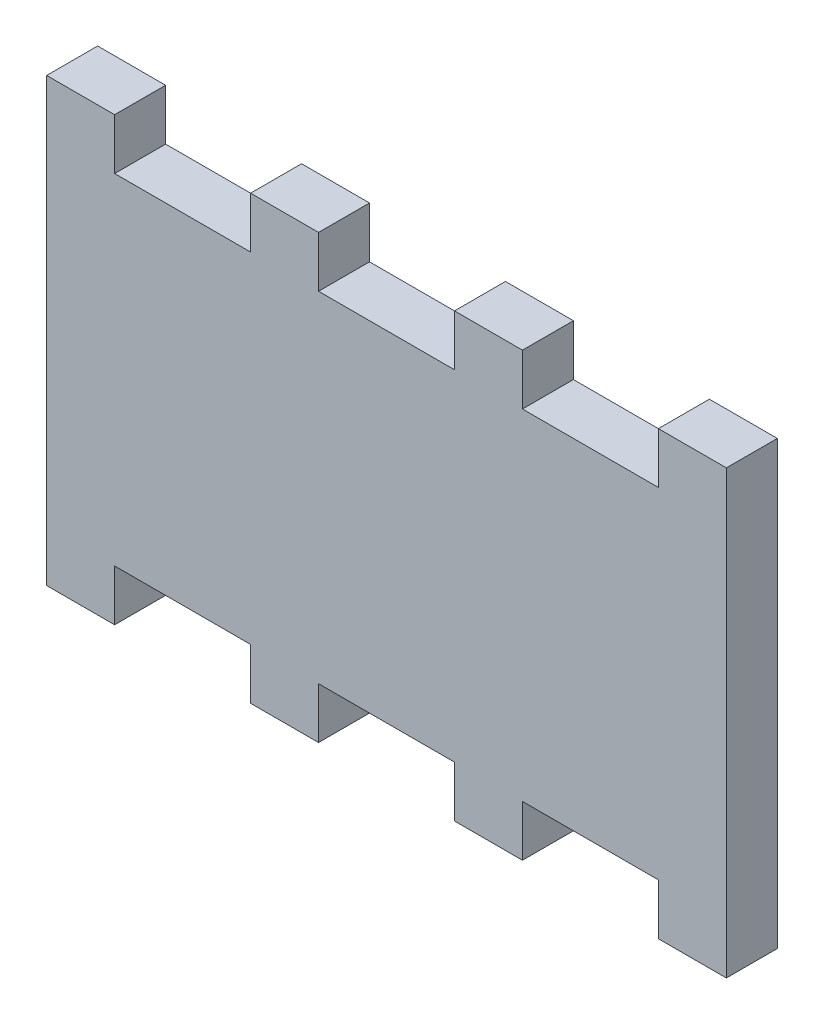
ISO-10303-21;
HEADER;
FILE_DESCRIPTION(('STEP AP214'),'2;1');
FILE_NAME('part.step','',(''),(''),'','','');
FILE_SCHEMA(('AUTOMOTIVE_DESIGN { 1 0 10303 214 1 1 1 1 }'));
ENDSEC;
DATA;
#1=APPLICATION_CONTEXT('core data for automotive mechanical design processes');
#2=APPLICATION_PROTOCOL_DEFINITION('international standard','automotive_design',2000,#1);
#3=PRODUCT_CONTEXT('',#1,'mechanical');
#4=PRODUCT('Part','Part','',(#3));
#5=PRODUCT_RELATED_PRODUCT_CATEGORY('part','',(#4));
#6=PRODUCT_DEFINITION_FORMATION('','',#4);
#7=PRODUCT_DEFINITION_CONTEXT('part definition',#1,'design');
#8=PRODUCT_DEFINITION('design','',#6,#7);
#9=PRODUCT_DEFINITION_SHAPE('','',#8);
#10=(LENGTH_UNIT() NAMED_UNIT(*) SI_UNIT(.MILLI.,.METRE.));
#11=(NAMED_UNIT(*) PLANE_ANGLE_UNIT() SI_UNIT($,.RADIAN.));
#12=(NAMED_UNIT(*) SI_UNIT($,.STERADIAN.) SOLID_ANGLE_UNIT());
#13=UNCERTAINTY_MEASURE_WITH_UNIT(LENGTH_MEASURE(1.E-05),#10,'distance_accuracy_value','');
#14=(GEOMETRIC_REPRESENTATION_CONTEXT(3) GLOBAL_UNCERTAINTY_ASSIGNED_CONTEXT((#13)) GLOBAL_UNIT_ASSIGNED_CONTEXT((#10,
#11,#12)) REPRESENTATION_CONTEXT('',''));
#15=CARTESIAN_POINT('',(0.,0.,0.));
#16=DIRECTION('',(0.,0.,1.));
#17=DIRECTION('',(1.,0.,0.));
#18=AXIS2_PLACEMENT_3D('',#15,#16,#17);
#19=CARTESIAN_POINT('',(0.,-6.,6.));
#20=DIRECTION('',(0.,1.,0.));
#21=DIRECTION('',(0.,0.,1.));
#22=AXIS2_PLACEMENT_3D('',#19,#20,#21);
#23=PLANE('',#22);
#24=DIRECTION('',(1.,0.,0.));
#25=VECTOR('',#24,1.);
#26=CARTESIAN_POINT('',(0.,-6.,0.));
#27=LINE('',#26,#25);
#28=CARTESIAN_POINT('',(0.,-6.,0.));
#29=VERTEX_POINT('',#28);
#30=CARTESIAN_POINT('',(8.,-6.,0.));
#31=VERTEX_POINT('',#30);
#32=EDGE_CURVE('E191',#29,#31,#27,.T.);
#33=ORIENTED_EDGE('',*,*,#32,.T.);
#34=DIRECTION('',(0.,0.,-1.));
#35=VECTOR('',#34,1.);
#36=CARTESIAN_POINT('',(8.,-6.,6.));
#37=LINE('',#36,#35);
#38=CARTESIAN_POINT('',(8.,-6.,6.));
#39=VERTEX_POINT('',#38);
#40=EDGE_CURVE('E136',#39,#31,#37,.T.);
#41=ORIENTED_EDGE('',*,*,#40,.F.);
#42=DIRECTION('',(1.,0.,0.));
#43=VECTOR('',#42,1.);
#44=CARTESIAN_POINT('',(0.,-6.,6.));
#45=LINE('',#44,#43);
#46=CARTESIAN_POINT('',(0.,-6.,6.));
#47=VERTEX_POINT('',#46);
#48=EDGE_CURVE('E274',#47,#39,#45,.T.);
#49=ORIENTED_EDGE('',*,*,#48,.F.);
#50=DIRECTION('',(0.,0.,-1.));
#51=VECTOR('',#50,1.);
#52=CARTESIAN_POINT('',(0.,-6.,6.));
#53=LINE('',#52,#51);
#54=EDGE_CURVE('E267',#47,#29,#53,.T.);
#55=ORIENTED_EDGE('',*,*,#54,.T.);
#56=EDGE_LOOP('',(#33,#41,#49,#55));
#57=FACE_BOUND('',#56,.T.);
#58=ADVANCED_FACE('F126',(#57),#23,.F.);
#59=CARTESIAN_POINT('',(8.,0.,6.));
#60=DIRECTION('',(-1.,0.,0.));
#61=DIRECTION('',(0.,0.,1.));
#62=AXIS2_PLACEMENT_3D('',#59,#60,#61);
#63=PLANE('',#62);
#64=DIRECTION('',(0.,1.,0.));
#65=VECTOR('',#64,1.);
#66=CARTESIAN_POINT('',(8.,0.,0.));
#67=LINE('',#66,#65);
#68=CARTESIAN_POINT('',(8.,0.,0.));
#69=VERTEX_POINT('',#68);
#70=EDGE_CURVE('E329',#31,#69,#67,.T.);
#71=ORIENTED_EDGE('',*,*,#70,.T.);
#72=DIRECTION('',(0.,0.,-1.));
#73=VECTOR('',#72,1.);
#74=CARTESIAN_POINT('',(8.,0.,6.));
#75=LINE('',#74,#73);
#76=CARTESIAN_POINT('',(8.,0.,6.));
#77=VERTEX_POINT('',#76);
#78=EDGE_CURVE('E198',#77,#69,#75,.T.);
#79=ORIENTED_EDGE('',*,*,#78,.F.);
#80=DIRECTION('',(0.,1.,0.));
#81=VECTOR('',#80,1.);
#82=CARTESIAN_POINT('',(8.,0.,6.));
#83=LINE('',#82,#81);
#84=EDGE_CURVE('E395',#39,#77,#83,.T.);
#85=ORIENTED_EDGE('',*,*,#84,.F.);
#86=ORIENTED_EDGE('',*,*,#40,.T.);
#87=EDGE_LOOP('',(#71,#79,#85,#86));
#88=FACE_BOUND('',#87,.T.);
#89=ADVANCED_FACE('F413',(#88),#63,.F.);
#90=CARTESIAN_POINT('',(0.,0.,6.));
#91=DIRECTION('',(0.,1.,0.));
#92=DIRECTION('',(0.,0.,1.));
#93=AXIS2_PLACEMENT_3D('',#90,#91,#92);
#94=PLANE('',#93);
#95=DIRECTION('',(1.,0.,0.));
#96=VECTOR('',#95,1.);
#97=CARTESIAN_POINT('',(0.,0.,0.));
#98=LINE('',#97,#96);
#99=CARTESIAN_POINT('',(24.,0.,0.));
#100=VERTEX_POINT('',#99);
#101=EDGE_CURVE('E326',#69,#100,#98,.T.);
#102=ORIENTED_EDGE('',*,*,#101,.T.);
#103=DIRECTION('',(0.,0.,-1.));
#104=VECTOR('',#103,1.);
#105=CARTESIAN_POINT('',(24.,0.,6.));
#106=LINE('',#105,#104);
#107=CARTESIAN_POINT('',(24.,0.,6.));
#108=VERTEX_POINT('',#107);
#109=EDGE_CURVE('E201',#108,#100,#106,.T.);
#110=ORIENTED_EDGE('',*,*,#109,.F.);
#111=DIRECTION('',(1.,0.,0.));
#112=VECTOR('',#111,1.);
#113=CARTESIAN_POINT('',(0.,0.,6.));
#114=LINE('',#113,#112);
#115=EDGE_CURVE('E392',#77,#108,#114,.T.);
#116=ORIENTED_EDGE('',*,*,#115,.F.);
#117=ORIENTED_EDGE('',*,*,#78,.T.);
#118=EDGE_LOOP('',(#102,#110,#116,#117));
#119=FACE_BOUND('',#118,.T.);
#120=ADVANCED_FACE('F611',(#119),#94,.F.);
#121=CARTESIAN_POINT('',(24.,0.,6.));
#122=DIRECTION('',(-1.,0.,0.));
#123=DIRECTION('',(0.,0.,1.));
#124=AXIS2_PLACEMENT_3D('',#121,#122,#123);
#125=PLANE('',#124);
#126=DIRECTION('',(0.,1.,0.));
#127=VECTOR('',#126,1.);
#128=CARTESIAN_POINT('',(24.,0.,0.));
#129=LINE('',#128,#127);
#130=CARTESIAN_POINT('',(24.,-6.,0.));
#131=VERTEX_POINT('',#130);
#132=EDGE_CURVE('E323',#131,#100,#129,.T.);
#133=ORIENTED_EDGE('',*,*,#132,.F.);
#134=DIRECTION('',(0.,0.,-1.));
#135=VECTOR('',#134,1.);
#136=CARTESIAN_POINT('',(24.,-6.,6.));
#137=LINE('',#136,#135);
#138=CARTESIAN_POINT('',(24.,-6.,6.));
#139=VERTEX_POINT('',#138);
#140=EDGE_CURVE('E204',#139,#131,#137,.T.);
#141=ORIENTED_EDGE('',*,*,#140,.F.);
#142=DIRECTION('',(0.,1.,0.));
#143=VECTOR('',#142,1.);
#144=CARTESIAN_POINT('',(24.,0.,6.));
#145=LINE('',#144,#143);
#146=EDGE_CURVE('E389',#139,#108,#145,.T.);
#147=ORIENTED_EDGE('',*,*,#146,.T.);
#148=ORIENTED_EDGE('',*,*,#109,.T.);
#149=EDGE_LOOP('',(#133,#141,#147,#148));
#150=FACE_BOUND('',#149,.T.);
#151=ADVANCED_FACE('F614',(#150),#125,.T.);
#152=CARTESIAN_POINT('',(0.,-6.,6.));
#153=DIRECTION('',(0.,1.,0.));
#154=DIRECTION('',(0.,0.,1.));
#155=AXIS2_PLACEMENT_3D('',#152,#153,#154);
#156=PLANE('',#155);
#157=DIRECTION('',(1.,0.,0.));
#158=VECTOR('',#157,1.);
#159=CARTESIAN_POINT('',(0.,-6.,0.));
#160=LINE('',#159,#158);
#161=CARTESIAN_POINT('',(32.,-6.,0.));
#162=VERTEX_POINT('',#161);
#163=EDGE_CURVE('E320',#131,#162,#160,.T.);
#164=ORIENTED_EDGE('',*,*,#163,.T.);
#165=DIRECTION('',(0.,0.,-1.));
#166=VECTOR('',#165,1.);
#167=CARTESIAN_POINT('',(32.,-6.,6.));
#168=LINE('',#167,#166);
#169=CARTESIAN_POINT('',(32.,-6.,6.));
#170=VERTEX_POINT('',#169);
#171=EDGE_CURVE('E207',#170,#162,#168,.T.);
#172=ORIENTED_EDGE('',*,*,#171,.F.);
#173=DIRECTION('',(1.,0.,0.));
#174=VECTOR('',#173,1.);
#175=CARTESIAN_POINT('',(0.,-6.,6.));
#176=LINE('',#175,#174);
#177=EDGE_CURVE('E386',#139,#170,#176,.T.);
#178=ORIENTED_EDGE('',*,*,#177,.F.);
#179=ORIENTED_EDGE('',*,*,#140,.T.);
#180=EDGE_LOOP('',(#164,#172,#178,#179));
#181=FACE_BOUND('',#180,.T.);
#182=ADVANCED_FACE('F619',(#181),#156,.F.);
#183=CARTESIAN_POINT('',(32.,0.,6.));
#184=DIRECTION('',(-1.,0.,0.));
#185=DIRECTION('',(0.,0.,1.));
#186=AXIS2_PLACEMENT_3D('',#183,#184,#185);
#187=PLANE('',#186);
#188=DIRECTION('',(0.,1.,0.));
#189=VECTOR('',#188,1.);
#190=CARTESIAN_POINT('',(32.,0.,0.));
#191=LINE('',#190,#189);
#192=CARTESIAN_POINT('',(32.,0.,0.));
#193=VERTEX_POINT('',#192);
#194=EDGE_CURVE('E317',#162,#193,#191,.T.);
#195=ORIENTED_EDGE('',*,*,#194,.T.);
#196=DIRECTION('',(0.,0.,-1.));
#197=VECTOR('',#196,1.);
#198=CARTESIAN_POINT('',(32.,0.,6.));
#199=LINE('',#198,#197);
#200=CARTESIAN_POINT('',(32.,0.,6.));
#201=VERTEX_POINT('',#200);
#202=EDGE_CURVE('E210',#201,#193,#199,.T.);
#203=ORIENTED_EDGE('',*,*,#202,.F.);
#204=DIRECTION('',(0.,1.,0.));
#205=VECTOR('',#204,1.);
#206=CARTESIAN_POINT('',(32.,0.,6.));
#207=LINE('',#206,#205);
#208=EDGE_CURVE('E383',#170,#201,#207,.T.);
#209=ORIENTED_EDGE('',*,*,#208,.F.);
#210=ORIENTED_EDGE('',*,*,#171,.T.);
#211=EDGE_LOOP('',(#195,#203,#209,#210));
#212=FACE_BOUND('',#211,.T.);
#213=ADVANCED_FACE('F622',(#212),#187,.F.);
#214=CARTESIAN_POINT('',(48.,0.,0.));
#215=VERTEX_POINT('',#214);
#216=EDGE_CURVE('E316',#193,#215,#98,.T.);
#217=ORIENTED_EDGE('',*,*,#216,.T.);
#218=DIRECTION('',(0.,0.,-1.));
#219=VECTOR('',#218,1.);
#220=CARTESIAN_POINT('',(48.,0.,6.));
#221=LINE('',#220,#219);
#222=CARTESIAN_POINT('',(48.,0.,6.));
#223=VERTEX_POINT('',#222);
#224=EDGE_CURVE('E213',#223,#215,#221,.T.);
#225=ORIENTED_EDGE('',*,*,#224,.F.);
#226=EDGE_CURVE('E382',#201,#223,#114,.T.);
#227=ORIENTED_EDGE('',*,*,#226,.F.);
#228=ORIENTED_EDGE('',*,*,#202,.T.);
#229=EDGE_LOOP('',(#217,#225,#227,#228));
#230=FACE_BOUND('',#229,.T.);
#231=ADVANCED_FACE('F580',(#230),#94,.F.);
#232=CARTESIAN_POINT('',(48.,0.,6.));
#233=DIRECTION('',(-1.,0.,0.));
#234=DIRECTION('',(0.,0.,1.));
#235=AXIS2_PLACEMENT_3D('',#232,#233,#234);
#236=PLANE('',#235);
#237=DIRECTION('',(0.,1.,0.));
#238=VECTOR('',#237,1.);
#239=CARTESIAN_POINT('',(48.,0.,0.));
#240=LINE('',#239,#238);
#241=CARTESIAN_POINT('',(48.,-6.,0.));
#242=VERTEX_POINT('',#241);
#243=EDGE_CURVE('E313',#242,#215,#240,.T.);
#244=ORIENTED_EDGE('',*,*,#243,.F.);
#245=DIRECTION('',(0.,0.,-1.));
#246=VECTOR('',#245,1.);
#247=CARTESIAN_POINT('',(48.,-6.,6.));
#248=LINE('',#247,#246);
#249=CARTESIAN_POINT('',(48.,-6.,6.));
#250=VERTEX_POINT('',#249);
#251=EDGE_CURVE('E216',#250,#242,#248,.T.);
#252=ORIENTED_EDGE('',*,*,#251,.F.);
#253=DIRECTION('',(0.,1.,0.));
#254=VECTOR('',#253,1.);
#255=CARTESIAN_POINT('',(48.,0.,6.));
#256=LINE('',#255,#254);
#257=EDGE_CURVE('E379',#250,#223,#256,.T.);
#258=ORIENTED_EDGE('',*,*,#257,.T.);
#259=ORIENTED_EDGE('',*,*,#224,.T.);
#260=EDGE_LOOP('',(#244,#252,#258,#259));
#261=FACE_BOUND('',#260,.T.);
#262=ADVANCED_FACE('F589',(#261),#236,.T.);
#263=CARTESIAN_POINT('',(0.,-6.,6.));
#264=DIRECTION('',(0.,1.,0.));
#265=DIRECTION('',(0.,0.,1.));
#266=AXIS2_PLACEMENT_3D('',#263,#264,#265);
#267=PLANE('',#266);
#268=DIRECTION('',(1.,0.,0.));
#269=VECTOR('',#268,1.);
#270=CARTESIAN_POINT('',(0.,-6.,0.));
#271=LINE('',#270,#269);
#272=CARTESIAN_POINT('',(56.,-6.,0.));
#273=VERTEX_POINT('',#272);
#274=EDGE_CURVE('E310',#242,#273,#271,.T.);
#275=ORIENTED_EDGE('',*,*,#274,.T.);
#276=DIRECTION('',(0.,0.,-1.));
#277=VECTOR('',#276,1.);
#278=CARTESIAN_POINT('',(56.,-6.,6.));
#279=LINE('',#278,#277);
#280=CARTESIAN_POINT('',(56.,-6.,6.));
#281=VERTEX_POINT('',#280);
#282=EDGE_CURVE('E219',#281,#273,#279,.T.);
#283=ORIENTED_EDGE('',*,*,#282,.F.);
#284=DIRECTION('',(1.,0.,0.));
#285=VECTOR('',#284,1.);
#286=CARTESIAN_POINT('',(0.,-6.,6.));
#287=LINE('',#286,#285);
#288=EDGE_CURVE('E376',#250,#281,#287,.T.);
#289=ORIENTED_EDGE('',*,*,#288,.F.);
#290=ORIENTED_EDGE('',*,*,#251,.T.);
#291=EDGE_LOOP('',(#275,#283,#289,#290));
#292=FACE_BOUND('',#291,.T.);
#293=ADVANCED_FACE('F629',(#292),#267,.F.);
#294=CARTESIAN_POINT('',(56.,0.,6.));
#295=DIRECTION('',(-1.,0.,0.));
#296=DIRECTION('',(0.,0.,1.));
#297=AXIS2_PLACEMENT_3D('',#294,#295,#296);
#298=PLANE('',#297);
#299=DIRECTION('',(0.,1.,0.));
#300=VECTOR('',#299,1.);
#301=CARTESIAN_POINT('',(56.,0.,0.));
#302=LINE('',#301,#300);
#303=CARTESIAN_POINT('',(56.,0.,0.));
#304=VERTEX_POINT('',#303);
#305=EDGE_CURVE('E307',#273,#304,#302,.T.);
#306=ORIENTED_EDGE('',*,*,#305,.T.);
#307=DIRECTION('',(0.,0.,-1.));
#308=VECTOR('',#307,1.);
#309=CARTESIAN_POINT('',(56.,0.,6.));
#310=LINE('',#309,#308);
#311=CARTESIAN_POINT('',(56.,0.,6.));
#312=VERTEX_POINT('',#311);
#313=EDGE_CURVE('E222',#312,#304,#310,.T.);
#314=ORIENTED_EDGE('',*,*,#313,.F.);
#315=DIRECTION('',(0.,1.,0.));
#316=VECTOR('',#315,1.);
#317=CARTESIAN_POINT('',(56.,0.,6.));
#318=LINE('',#317,#316);
#319=EDGE_CURVE('E373',#281,#312,#318,.T.);
#320=ORIENTED_EDGE('',*,*,#319,.F.);
#321=ORIENTED_EDGE('',*,*,#282,.T.);
#322=EDGE_LOOP('',(#306,#314,#320,#321));
#323=FACE_BOUND('',#322,.T.);
#324=ADVANCED_FACE('F627',(#323),#298,.F.);
#325=CARTESIAN_POINT('',(72.,0.,0.));
#326=VERTEX_POINT('',#325);
#327=EDGE_CURVE('E178',#304,#326,#98,.T.);
#328=ORIENTED_EDGE('',*,*,#327,.T.);
#329=DIRECTION('',(0.,0.,1.));
#330=VECTOR('',#329,1.);
#331=CARTESIAN_POINT('',(72.,0.,6.));
#332=LINE('',#331,#330);
#333=CARTESIAN_POINT('',(72.,0.,6.));
#334=VERTEX_POINT('',#333);
#335=EDGE_CURVE('E12',#326,#334,#332,.T.);
#336=ORIENTED_EDGE('',*,*,#335,.T.);
#337=EDGE_CURVE('E372',#312,#334,#114,.T.);
#338=ORIENTED_EDGE('',*,*,#337,.F.);
#339=ORIENTED_EDGE('',*,*,#313,.T.);
#340=EDGE_LOOP('',(#328,#336,#338,#339));
#341=FACE_BOUND('',#340,.T.);
#342=ADVANCED_FACE('F574',(#341),#94,.F.);
#343=CARTESIAN_POINT('',(80.,0.,6.));
#344=DIRECTION('',(-1.,0.,0.));
#345=DIRECTION('',(0.,0.,1.));
#346=AXIS2_PLACEMENT_3D('',#343,#344,#345);
#347=PLANE('',#346);
#348=DIRECTION('',(0.,1.,0.));
#349=VECTOR('',#348,1.);
#350=CARTESIAN_POINT('',(80.,0.,0.));
#351=LINE('',#350,#349);
#352=CARTESIAN_POINT('',(80.,-6.,0.));
#353=VERTEX_POINT('',#352);
#354=CARTESIAN_POINT('',(80.,46.,0.));
#355=VERTEX_POINT('',#354);
#356=EDGE_CURVE('E165',#353,#355,#351,.T.);
#357=ORIENTED_EDGE('',*,*,#356,.T.);
#358=DIRECTION('',(0.,0.,-1.));
#359=VECTOR('',#358,1.);
#360=CARTESIAN_POINT('',(80.,46.,6.));
#361=LINE('',#360,#359);
#362=CARTESIAN_POINT('',(80.,46.,6.));
#363=VERTEX_POINT('',#362);
#364=EDGE_CURVE('E225',#363,#355,#361,.T.);
#365=ORIENTED_EDGE('',*,*,#364,.F.);
#366=DIRECTION('',(0.,1.,0.));
#367=VECTOR('',#366,1.);
#368=CARTESIAN_POINT('',(80.,0.,6.));
#369=LINE('',#368,#367);
#370=CARTESIAN_POINT('',(80.,-6.,6.));
#371=VERTEX_POINT('',#370);
#372=EDGE_CURVE('E188',#371,#363,#369,.T.);
#373=ORIENTED_EDGE('',*,*,#372,.F.);
#374=DIRECTION('',(0.,0.,-1.));
#375=VECTOR('',#374,1.);
#376=CARTESIAN_POINT('',(80.,-6.,6.));
#377=LINE('',#376,#375);
#378=EDGE_CURVE('E182',#371,#353,#377,.T.);
#379=ORIENTED_EDGE('',*,*,#378,.T.);
#380=EDGE_LOOP('',(#357,#365,#373,#379));
#381=FACE_BOUND('',#380,.T.);
#382=ADVANCED_FACE('F186',(#381),#347,.F.);
#383=CARTESIAN_POINT('',(0.,46.,6.));
#384=DIRECTION('',(0.,1.,0.));
#385=DIRECTION('',(0.,0.,1.));
#386=AXIS2_PLACEMENT_3D('',#383,#384,#385);
#387=PLANE('',#386);
#388=DIRECTION('',(1.,0.,0.));
#389=VECTOR('',#388,1.);
#390=CARTESIAN_POINT('',(0.,46.,0.));
#391=LINE('',#390,#389);
#392=CARTESIAN_POINT('',(72.,46.,0.));
#393=VERTEX_POINT('',#392);
#394=EDGE_CURVE('E174',#393,#355,#391,.T.);
#395=ORIENTED_EDGE('',*,*,#394,.F.);
#396=DIRECTION('',(0.,0.,-1.));
#397=VECTOR('',#396,1.);
#398=CARTESIAN_POINT('',(72.,46.,6.));
#399=LINE('',#398,#397);
#400=CARTESIAN_POINT('',(72.,46.,6.));
#401=VERTEX_POINT('',#400);
#402=EDGE_CURVE('E228',#401,#393,#399,.T.);
#403=ORIENTED_EDGE('',*,*,#402,.F.);
#404=DIRECTION('',(1.,0.,0.));
#405=VECTOR('',#404,1.);
#406=CARTESIAN_POINT('',(0.,46.,6.));
#407=LINE('',#406,#405);
#408=EDGE_CURVE('E368',#401,#363,#407,.T.);
#409=ORIENTED_EDGE('',*,*,#408,.T.);
#410=ORIENTED_EDGE('',*,*,#364,.T.);
#411=EDGE_LOOP('',(#395,#403,#409,#410));
#412=FACE_BOUND('',#411,.T.);
#413=ADVANCED_FACE('F528',(#412),#387,.T.);
#414=CARTESIAN_POINT('',(72.,0.,6.));
#415=DIRECTION('',(-1.,0.,0.));
#416=DIRECTION('',(0.,0.,1.));
#417=AXIS2_PLACEMENT_3D('',#414,#415,#416);
#418=PLANE('',#417);
#419=DIRECTION('',(0.,1.,0.));
#420=VECTOR('',#419,1.);
#421=CARTESIAN_POINT('',(72.,0.,0.));
#422=LINE('',#421,#420);
#423=CARTESIAN_POINT('',(72.,40.,0.));
#424=VERTEX_POINT('',#423);
#425=EDGE_CURVE('E304',#424,#393,#422,.T.);
#426=ORIENTED_EDGE('',*,*,#425,.F.);
#427=DIRECTION('',(0.,0.,-1.));
#428=VECTOR('',#427,1.);
#429=CARTESIAN_POINT('',(72.,40.,6.));
#430=LINE('',#429,#428);
#431=CARTESIAN_POINT('',(72.,40.,6.));
#432=VERTEX_POINT('',#431);
#433=EDGE_CURVE('E231',#432,#424,#430,.T.);
#434=ORIENTED_EDGE('',*,*,#433,.F.);
#435=DIRECTION('',(0.,1.,0.));
#436=VECTOR('',#435,1.);
#437=CARTESIAN_POINT('',(72.,0.,6.));
#438=LINE('',#437,#436);
#439=EDGE_CURVE('E365',#432,#401,#438,.T.);
#440=ORIENTED_EDGE('',*,*,#439,.T.);
#441=ORIENTED_EDGE('',*,*,#402,.T.);
#442=EDGE_LOOP('',(#426,#434,#440,#441));
#443=FACE_BOUND('',#442,.T.);
#444=ADVANCED_FACE('F523',(#443),#418,.T.);
#445=CARTESIAN_POINT('',(0.,40.,6.));
#446=DIRECTION('',(0.,1.,0.));
#447=DIRECTION('',(0.,0.,1.));
#448=AXIS2_PLACEMENT_3D('',#445,#446,#447);
#449=PLANE('',#448);
#450=DIRECTION('',(1.,0.,0.));
#451=VECTOR('',#450,1.);
#452=CARTESIAN_POINT('',(0.,40.,0.));
#453=LINE('',#452,#451);
#454=CARTESIAN_POINT('',(56.,40.,0.));
#455=VERTEX_POINT('',#454);
#456=EDGE_CURVE('E301',#455,#424,#453,.T.);
#457=ORIENTED_EDGE('',*,*,#456,.F.);
#458=DIRECTION('',(0.,0.,-1.));
#459=VECTOR('',#458,1.);
#460=CARTESIAN_POINT('',(56.,40.,6.));
#461=LINE('',#460,#459);
#462=CARTESIAN_POINT('',(56.,40.,6.));
#463=VERTEX_POINT('',#462);
#464=EDGE_CURVE('E234',#463,#455,#461,.T.);
#465=ORIENTED_EDGE('',*,*,#464,.F.);
#466=DIRECTION('',(1.,0.,0.));
#467=VECTOR('',#466,1.);
#468=CARTESIAN_POINT('',(0.,40.,6.));
#469=LINE('',#468,#467);
#470=EDGE_CURVE('E362',#463,#432,#469,.T.);
#471=ORIENTED_EDGE('',*,*,#470,.T.);
#472=ORIENTED_EDGE('',*,*,#433,.T.);
#473=EDGE_LOOP('',(#457,#465,#471,#472));
#474=FACE_BOUND('',#473,.T.);
#475=ADVANCED_FACE('F514',(#474),#449,.T.);
#476=CARTESIAN_POINT('',(56.,0.,6.));
#477=DIRECTION('',(-1.,0.,0.));
#478=DIRECTION('',(0.,0.,1.));
#479=AXIS2_PLACEMENT_3D('',#476,#477,#478);
#480=PLANE('',#479);
#481=DIRECTION('',(0.,1.,0.));
#482=VECTOR('',#481,1.);
#483=CARTESIAN_POINT('',(56.,0.,0.));
#484=LINE('',#483,#482);
#485=CARTESIAN_POINT('',(56.,46.,0.));
#486=VERTEX_POINT('',#485);
#487=EDGE_CURVE('E298',#455,#486,#484,.T.);
#488=ORIENTED_EDGE('',*,*,#487,.T.);
#489=DIRECTION('',(0.,0.,-1.));
#490=VECTOR('',#489,1.);
#491=CARTESIAN_POINT('',(56.,46.,6.));
#492=LINE('',#491,#490);
#493=CARTESIAN_POINT('',(56.,46.,6.));
#494=VERTEX_POINT('',#493);
#495=EDGE_CURVE('E237',#494,#486,#492,.T.);
#496=ORIENTED_EDGE('',*,*,#495,.F.);
#497=DIRECTION('',(0.,1.,0.));
#498=VECTOR('',#497,1.);
#499=CARTESIAN_POINT('',(56.,0.,6.));
#500=LINE('',#499,#498);
#501=EDGE_CURVE('E359',#463,#494,#500,.T.);
#502=ORIENTED_EDGE('',*,*,#501,.F.);
#503=ORIENTED_EDGE('',*,*,#464,.T.);
#504=EDGE_LOOP('',(#488,#496,#502,#503));
#505=FACE_BOUND('',#504,.T.);
#506=ADVANCED_FACE('F737',(#505),#480,.F.);
#507=CARTESIAN_POINT('',(0.,46.,6.));
#508=DIRECTION('',(0.,1.,0.));
#509=DIRECTION('',(0.,0.,1.));
#510=AXIS2_PLACEMENT_3D('',#507,#508,#509);
#511=PLANE('',#510);
#512=DIRECTION('',(1.,0.,0.));
#513=VECTOR('',#512,1.);
#514=CARTESIAN_POINT('',(0.,46.,0.));
#515=LINE('',#514,#513);
#516=CARTESIAN_POINT('',(48.,46.,0.));
#517=VERTEX_POINT('',#516);
#518=EDGE_CURVE('E295',#517,#486,#515,.T.);
#519=ORIENTED_EDGE('',*,*,#518,.F.);
#520=DIRECTION('',(0.,0.,-1.));
#521=VECTOR('',#520,1.);
#522=CARTESIAN_POINT('',(48.,46.,6.));
#523=LINE('',#522,#521);
#524=CARTESIAN_POINT('',(48.,46.,6.));
#525=VERTEX_POINT('',#524);
#526=EDGE_CURVE('E240',#525,#517,#523,.T.);
#527=ORIENTED_EDGE('',*,*,#526,.F.);
#528=DIRECTION('',(1.,0.,0.));
#529=VECTOR('',#528,1.);
#530=CARTESIAN_POINT('',(0.,46.,6.));
#531=LINE('',#530,#529);
#532=EDGE_CURVE('E356',#525,#494,#531,.T.);
#533=ORIENTED_EDGE('',*,*,#532,.T.);
#534=ORIENTED_EDGE('',*,*,#495,.T.);
#535=EDGE_LOOP('',(#519,#527,#533,#534));
#536=FACE_BOUND('',#535,.T.);
#537=ADVANCED_FACE('F507',(#536),#511,.T.);
#538=CARTESIAN_POINT('',(48.,0.,6.));
#539=DIRECTION('',(-1.,0.,0.));
#540=DIRECTION('',(0.,0.,1.));
#541=AXIS2_PLACEMENT_3D('',#538,#539,#540);
#542=PLANE('',#541);
#543=DIRECTION('',(0.,1.,0.));
#544=VECTOR('',#543,1.);
#545=CARTESIAN_POINT('',(48.,0.,0.));
#546=LINE('',#545,#544);
#547=CARTESIAN_POINT('',(48.,40.,0.));
#548=VERTEX_POINT('',#547);
#549=EDGE_CURVE('E292',#548,#517,#546,.T.);
#550=ORIENTED_EDGE('',*,*,#549,.F.);
#551=DIRECTION('',(0.,0.,-1.));
#552=VECTOR('',#551,1.);
#553=CARTESIAN_POINT('',(48.,40.,6.));
#554=LINE('',#553,#552);
#555=CARTESIAN_POINT('',(48.,40.,6.));
#556=VERTEX_POINT('',#555);
#557=EDGE_CURVE('E243',#556,#548,#554,.T.);
#558=ORIENTED_EDGE('',*,*,#557,.F.);
#559=DIRECTION('',(0.,1.,0.));
#560=VECTOR('',#559,1.);
#561=CARTESIAN_POINT('',(48.,0.,6.));
#562=LINE('',#561,#560);
#563=EDGE_CURVE('E353',#556,#525,#562,.T.);
#564=ORIENTED_EDGE('',*,*,#563,.T.);
#565=ORIENTED_EDGE('',*,*,#526,.T.);
#566=EDGE_LOOP('',(#550,#558,#564,#565));
#567=FACE_BOUND('',#566,.T.);
#568=ADVANCED_FACE('F501',(#567),#542,.T.);
#569=CARTESIAN_POINT('',(32.,40.,0.));
#570=VERTEX_POINT('',#569);
#571=EDGE_CURVE('E291',#570,#548,#453,.T.);
#572=ORIENTED_EDGE('',*,*,#571,.F.);
#573=DIRECTION('',(0.,0.,-1.));
#574=VECTOR('',#573,1.);
#575=CARTESIAN_POINT('',(32.,40.,6.));
#576=LINE('',#575,#574);
#577=CARTESIAN_POINT('',(32.,40.,6.));
#578=VERTEX_POINT('',#577);
#579=EDGE_CURVE('E246',#578,#570,#576,.T.);
#580=ORIENTED_EDGE('',*,*,#579,.F.);
#581=EDGE_CURVE('E352',#578,#556,#469,.T.);
#582=ORIENTED_EDGE('',*,*,#581,.T.);
#583=ORIENTED_EDGE('',*,*,#557,.T.);
#584=EDGE_LOOP('',(#572,#580,#582,#583));
#585=FACE_BOUND('',#584,.T.);
#586=ADVANCED_FACE('F492',(#585),#449,.T.);
#587=CARTESIAN_POINT('',(32.,0.,6.));
#588=DIRECTION('',(-1.,0.,0.));
#589=DIRECTION('',(0.,0.,1.));
#590=AXIS2_PLACEMENT_3D('',#587,#588,#589);
#591=PLANE('',#590);
#592=DIRECTION('',(0.,1.,0.));
#593=VECTOR('',#592,1.);
#594=CARTESIAN_POINT('',(32.,0.,0.));
#595=LINE('',#594,#593);
#596=CARTESIAN_POINT('',(32.,46.,0.));
#597=VERTEX_POINT('',#596);
#598=EDGE_CURVE('E288',#570,#597,#595,.T.);
#599=ORIENTED_EDGE('',*,*,#598,.T.);
#600=DIRECTION('',(0.,0.,-1.));
#601=VECTOR('',#600,1.);
#602=CARTESIAN_POINT('',(32.,46.,6.));
#603=LINE('',#602,#601);
#604=CARTESIAN_POINT('',(32.,46.,6.));
#605=VERTEX_POINT('',#604);
#606=EDGE_CURVE('E249',#605,#597,#603,.T.);
#607=ORIENTED_EDGE('',*,*,#606,.F.);
#608=DIRECTION('',(0.,1.,0.));
#609=VECTOR('',#608,1.);
#610=CARTESIAN_POINT('',(32.,0.,6.));
#611=LINE('',#610,#609);
#612=EDGE_CURVE('E349',#578,#605,#611,.T.);
#613=ORIENTED_EDGE('',*,*,#612,.F.);
#614=ORIENTED_EDGE('',*,*,#579,.T.);
#615=EDGE_LOOP('',(#599,#607,#613,#614));
#616=FACE_BOUND('',#615,.T.);
#617=ADVANCED_FACE('F771',(#616),#591,.F.);
#618=CARTESIAN_POINT('',(0.,46.,6.));
#619=DIRECTION('',(0.,1.,0.));
#620=DIRECTION('',(0.,0.,1.));
#621=AXIS2_PLACEMENT_3D('',#618,#619,#620);
#622=PLANE('',#621);
#623=DIRECTION('',(1.,0.,0.));
#624=VECTOR('',#623,1.);
#625=CARTESIAN_POINT('',(0.,46.,0.));
#626=LINE('',#625,#624);
#627=CARTESIAN_POINT('',(24.,46.,0.));
#628=VERTEX_POINT('',#627);
#629=EDGE_CURVE('E285',#628,#597,#626,.T.);
#630=ORIENTED_EDGE('',*,*,#629,.F.);
#631=DIRECTION('',(0.,0.,-1.));
#632=VECTOR('',#631,1.);
#633=CARTESIAN_POINT('',(24.,46.,6.));
#634=LINE('',#633,#632);
#635=CARTESIAN_POINT('',(24.,46.,6.));
#636=VERTEX_POINT('',#635);
#637=EDGE_CURVE('E252',#636,#628,#634,.T.);
#638=ORIENTED_EDGE('',*,*,#637,.F.);
#639=DIRECTION('',(1.,0.,0.));
#640=VECTOR('',#639,1.);
#641=CARTESIAN_POINT('',(0.,46.,6.));
#642=LINE('',#641,#640);
#643=EDGE_CURVE('E346',#636,#605,#642,.T.);
#644=ORIENTED_EDGE('',*,*,#643,.T.);
#645=ORIENTED_EDGE('',*,*,#606,.T.);
#646=EDGE_LOOP('',(#630,#638,#644,#645));
#647=FACE_BOUND('',#646,.T.);
#648=ADVANCED_FACE('F780',(#647),#622,.T.);
#649=CARTESIAN_POINT('',(24.,0.,6.));
#650=DIRECTION('',(-1.,0.,0.));
#651=DIRECTION('',(0.,0.,1.));
#652=AXIS2_PLACEMENT_3D('',#649,#650,#651);
#653=PLANE('',#652);
#654=DIRECTION('',(0.,1.,0.));
#655=VECTOR('',#654,1.);
#656=CARTESIAN_POINT('',(24.,0.,0.));
#657=LINE('',#656,#655);
#658=CARTESIAN_POINT('',(24.,40.,0.));
#659=VERTEX_POINT('',#658);
#660=EDGE_CURVE('E282',#659,#628,#657,.T.);
#661=ORIENTED_EDGE('',*,*,#660,.F.);
#662=DIRECTION('',(0.,0.,-1.));
#663=VECTOR('',#662,1.);
#664=CARTESIAN_POINT('',(24.,40.,6.));
#665=LINE('',#664,#663);
#666=CARTESIAN_POINT('',(24.,40.,6.));
#667=VERTEX_POINT('',#666);
#668=EDGE_CURVE('E255',#667,#659,#665,.T.);
#669=ORIENTED_EDGE('',*,*,#668,.F.);
#670=DIRECTION('',(0.,1.,0.));
#671=VECTOR('',#670,1.);
#672=CARTESIAN_POINT('',(24.,0.,6.));
#673=LINE('',#672,#671);
#674=EDGE_CURVE('E343',#667,#636,#673,.T.);
#675=ORIENTED_EDGE('',*,*,#674,.T.);
#676=ORIENTED_EDGE('',*,*,#637,.T.);
#677=EDGE_LOOP('',(#661,#669,#675,#676));
#678=FACE_BOUND('',#677,.T.);
#679=ADVANCED_FACE('F563',(#678),#653,.T.);
#680=CARTESIAN_POINT('',(8.,40.,0.));
#681=VERTEX_POINT('',#680);
#682=EDGE_CURVE('E281',#681,#659,#453,.T.);
#683=ORIENTED_EDGE('',*,*,#682,.F.);
#684=DIRECTION('',(0.,0.,-1.));
#685=VECTOR('',#684,1.);
#686=CARTESIAN_POINT('',(8.,40.,6.));
#687=LINE('',#686,#685);
#688=CARTESIAN_POINT('',(8.,40.,6.));
#689=VERTEX_POINT('',#688);
#690=EDGE_CURVE('E258',#689,#681,#687,.T.);
#691=ORIENTED_EDGE('',*,*,#690,.F.);
#692=EDGE_CURVE('E342',#689,#667,#469,.T.);
#693=ORIENTED_EDGE('',*,*,#692,.T.);
#694=ORIENTED_EDGE('',*,*,#668,.T.);
#695=EDGE_LOOP('',(#683,#691,#693,#694));
#696=FACE_BOUND('',#695,.T.);
#697=ADVANCED_FACE('F480',(#696),#449,.T.);
#698=CARTESIAN_POINT('',(8.,0.,6.));
#699=DIRECTION('',(-1.,0.,0.));
#700=DIRECTION('',(0.,0.,1.));
#701=AXIS2_PLACEMENT_3D('',#698,#699,#700);
#702=PLANE('',#701);
#703=DIRECTION('',(0.,1.,0.));
#704=VECTOR('',#703,1.);
#705=CARTESIAN_POINT('',(8.,0.,0.));
#706=LINE('',#705,#704);
#707=CARTESIAN_POINT('',(8.,46.,0.));
#708=VERTEX_POINT('',#707);
#709=EDGE_CURVE('E278',#681,#708,#706,.T.);
#710=ORIENTED_EDGE('',*,*,#709,.T.);
#711=DIRECTION('',(0.,0.,-1.));
#712=VECTOR('',#711,1.);
#713=CARTESIAN_POINT('',(8.,46.,6.));
#714=LINE('',#713,#712);
#715=CARTESIAN_POINT('',(8.,46.,6.));
#716=VERTEX_POINT('',#715);
#717=EDGE_CURVE('E261',#716,#708,#714,.T.);
#718=ORIENTED_EDGE('',*,*,#717,.F.);
#719=DIRECTION('',(0.,1.,0.));
#720=VECTOR('',#719,1.);
#721=CARTESIAN_POINT('',(8.,0.,6.));
#722=LINE('',#721,#720);
#723=EDGE_CURVE('E339',#689,#716,#722,.T.);
#724=ORIENTED_EDGE('',*,*,#723,.F.);
#725=ORIENTED_EDGE('',*,*,#690,.T.);
#726=EDGE_LOOP('',(#710,#718,#724,#725));
#727=FACE_BOUND('',#726,.T.);
#728=ADVANCED_FACE('F555',(#727),#702,.F.);
#729=CARTESIAN_POINT('',(0.,46.,6.));
#730=DIRECTION('',(0.,1.,0.));
#731=DIRECTION('',(0.,0.,1.));
#732=AXIS2_PLACEMENT_3D('',#729,#730,#731);
#733=PLANE('',#732);
#734=DIRECTION('',(1.,0.,0.));
#735=VECTOR('',#734,1.);
#736=CARTESIAN_POINT('',(0.,46.,0.));
#737=LINE('',#736,#735);
#738=CARTESIAN_POINT('',(0.,46.,0.));
#739=VERTEX_POINT('',#738);
#740=EDGE_CURVE('E275',#739,#708,#737,.T.);
#741=ORIENTED_EDGE('',*,*,#740,.F.);
#742=DIRECTION('',(0.,0.,-1.));
#743=VECTOR('',#742,1.);
#744=CARTESIAN_POINT('',(0.,46.,6.));
#745=LINE('',#744,#743);
#746=CARTESIAN_POINT('',(0.,46.,6.));
#747=VERTEX_POINT('',#746);
#748=EDGE_CURVE('E264',#747,#739,#745,.T.);
#749=ORIENTED_EDGE('',*,*,#748,.F.);
#750=DIRECTION('',(1.,0.,0.));
#751=VECTOR('',#750,1.);
#752=CARTESIAN_POINT('',(0.,46.,6.));
#753=LINE('',#752,#751);
#754=EDGE_CURVE('E336',#747,#716,#753,.T.);
#755=ORIENTED_EDGE('',*,*,#754,.T.);
#756=ORIENTED_EDGE('',*,*,#717,.T.);
#757=EDGE_LOOP('',(#741,#749,#755,#756));
#758=FACE_BOUND('',#757,.T.);
#759=ADVANCED_FACE('F472',(#758),#733,.T.);
#760=CARTESIAN_POINT('',(0.,0.,6.));
#761=DIRECTION('',(-1.,0.,0.));
#762=DIRECTION('',(0.,0.,1.));
#763=AXIS2_PLACEMENT_3D('',#760,#761,#762);
#764=PLANE('',#763);
#765=DIRECTION('',(0.,1.,0.));
#766=VECTOR('',#765,1.);
#767=CARTESIAN_POINT('',(0.,0.,0.));
#768=LINE('',#767,#766);
#769=EDGE_CURVE('E271',#29,#739,#768,.T.);
#770=ORIENTED_EDGE('',*,*,#769,.F.);
#771=ORIENTED_EDGE('',*,*,#54,.F.);
#772=DIRECTION('',(0.,1.,0.));
#773=VECTOR('',#772,1.);
#774=CARTESIAN_POINT('',(0.,0.,6.));
#775=LINE('',#774,#773);
#776=EDGE_CURVE('E270',#47,#747,#775,.T.);
#777=ORIENTED_EDGE('',*,*,#776,.T.);
#778=ORIENTED_EDGE('',*,*,#748,.T.);
#779=EDGE_LOOP('',(#770,#771,#777,#778));
#780=FACE_BOUND('',#779,.T.);
#781=ADVANCED_FACE('F467',(#780),#764,.T.);
#782=CARTESIAN_POINT('',(0.,0.,6.));
#783=DIRECTION('',(0.,0.,1.));
#784=DIRECTION('',(1.,0.,0.));
#785=AXIS2_PLACEMENT_3D('',#782,#783,#784);
#786=PLANE('',#785);
#787=ORIENTED_EDGE('',*,*,#48,.T.);
#788=ORIENTED_EDGE('',*,*,#84,.T.);
#789=ORIENTED_EDGE('',*,*,#115,.T.);
#790=ORIENTED_EDGE('',*,*,#146,.F.);
#791=ORIENTED_EDGE('',*,*,#177,.T.);
#792=ORIENTED_EDGE('',*,*,#208,.T.);
#793=ORIENTED_EDGE('',*,*,#226,.T.);
#794=ORIENTED_EDGE('',*,*,#257,.F.);
#795=ORIENTED_EDGE('',*,*,#288,.T.);
#796=ORIENTED_EDGE('',*,*,#319,.T.);
#797=ORIENTED_EDGE('',*,*,#337,.T.);
#798=DIRECTION('',(0.,1.,0.));
#799=VECTOR('',#798,1.);
#800=CARTESIAN_POINT('',(72.,-6.,6.));
#801=LINE('',#800,#799);
#802=CARTESIAN_POINT('',(72.,-6.,6.));
#803=VERTEX_POINT('',#802);
#804=EDGE_CURVE('E183',#803,#334,#801,.T.);
#805=ORIENTED_EDGE('',*,*,#804,.F.);
#806=DIRECTION('',(1.,0.,0.));
#807=VECTOR('',#806,1.);
#808=CARTESIAN_POINT('',(72.,-6.,6.));
#809=LINE('',#808,#807);
#810=EDGE_CURVE('E190',#803,#371,#809,.T.);
#811=ORIENTED_EDGE('',*,*,#810,.T.);
#812=ORIENTED_EDGE('',*,*,#372,.T.);
#813=ORIENTED_EDGE('',*,*,#408,.F.);
#814=ORIENTED_EDGE('',*,*,#439,.F.);
#815=ORIENTED_EDGE('',*,*,#470,.F.);
#816=ORIENTED_EDGE('',*,*,#501,.T.);
#817=ORIENTED_EDGE('',*,*,#532,.F.);
#818=ORIENTED_EDGE('',*,*,#563,.F.);
#819=ORIENTED_EDGE('',*,*,#581,.F.);
#820=ORIENTED_EDGE('',*,*,#612,.T.);
#821=ORIENTED_EDGE('',*,*,#643,.F.);
#822=ORIENTED_EDGE('',*,*,#674,.F.);
#823=ORIENTED_EDGE('',*,*,#692,.F.);
#824=ORIENTED_EDGE('',*,*,#723,.T.);
#825=ORIENTED_EDGE('',*,*,#754,.F.);
#826=ORIENTED_EDGE('',*,*,#776,.F.);
#827=EDGE_LOOP('',(#787,#788,#789,#790,#791,#792,#793,#794,#795,#796,#797,#805,#811,#812,#813,
#814,#815,#816,#817,#818,#819,#820,#821,#822,#823,#824,#825,#826));
#828=FACE_BOUND('',#827,.T.);
#829=ADVANCED_FACE('F404',(#828),#786,.T.);
#830=CARTESIAN_POINT('',(0.,0.,0.));
#831=DIRECTION('',(0.,0.,1.));
#832=DIRECTION('',(1.,0.,0.));
#833=AXIS2_PLACEMENT_3D('',#830,#831,#832);
#834=PLANE('',#833);
#835=ORIENTED_EDGE('',*,*,#32,.F.);
#836=ORIENTED_EDGE('',*,*,#769,.T.);
#837=ORIENTED_EDGE('',*,*,#740,.T.);
#838=ORIENTED_EDGE('',*,*,#709,.F.);
#839=ORIENTED_EDGE('',*,*,#682,.T.);
#840=ORIENTED_EDGE('',*,*,#660,.T.);
#841=ORIENTED_EDGE('',*,*,#629,.T.);
#842=ORIENTED_EDGE('',*,*,#598,.F.);
#843=ORIENTED_EDGE('',*,*,#571,.T.);
#844=ORIENTED_EDGE('',*,*,#549,.T.);
#845=ORIENTED_EDGE('',*,*,#518,.T.);
#846=ORIENTED_EDGE('',*,*,#487,.F.);
#847=ORIENTED_EDGE('',*,*,#456,.T.);
#848=ORIENTED_EDGE('',*,*,#425,.T.);
#849=ORIENTED_EDGE('',*,*,#394,.T.);
#850=ORIENTED_EDGE('',*,*,#356,.F.);
#851=DIRECTION('',(1.,0.,0.));
#852=VECTOR('',#851,1.);
#853=CARTESIAN_POINT('',(72.,-6.,0.));
#854=LINE('',#853,#852);
#855=CARTESIAN_POINT('',(72.,-6.,0.));
#856=VERTEX_POINT('',#855);
#857=EDGE_CURVE('E169',#856,#353,#854,.T.);
#858=ORIENTED_EDGE('',*,*,#857,.F.);
#859=DIRECTION('',(0.,1.,0.));
#860=VECTOR('',#859,1.);
#861=CARTESIAN_POINT('',(72.,-6.,0.));
#862=LINE('',#861,#860);
#863=EDGE_CURVE('E184',#856,#326,#862,.T.);
#864=ORIENTED_EDGE('',*,*,#863,.T.);
#865=ORIENTED_EDGE('',*,*,#327,.F.);
#866=ORIENTED_EDGE('',*,*,#305,.F.);
#867=ORIENTED_EDGE('',*,*,#274,.F.);
#868=ORIENTED_EDGE('',*,*,#243,.T.);
#869=ORIENTED_EDGE('',*,*,#216,.F.);
#870=ORIENTED_EDGE('',*,*,#194,.F.);
#871=ORIENTED_EDGE('',*,*,#163,.F.);
#872=ORIENTED_EDGE('',*,*,#132,.T.);
#873=ORIENTED_EDGE('',*,*,#101,.F.);
#874=ORIENTED_EDGE('',*,*,#70,.F.);
#875=EDGE_LOOP('',(#835,#836,#837,#838,#839,#840,#841,#842,#843,#844,#845,#846,#847,#848,#849,
#850,#858,#864,#865,#866,#867,#868,#869,#870,#871,#872,#873,#874));
#876=FACE_BOUND('',#875,.T.);
#877=ADVANCED_FACE('F167',(#876),#834,.F.);
#878=CARTESIAN_POINT('',(72.,-6.,6.));
#879=DIRECTION('',(-1.,0.,0.));
#880=DIRECTION('',(0.,0.,1.));
#881=AXIS2_PLACEMENT_3D('',#878,#879,#880);
#882=PLANE('',#881);
#883=ORIENTED_EDGE('',*,*,#863,.F.);
#884=DIRECTION('',(0.,0.,-1.));
#885=VECTOR('',#884,1.);
#886=CARTESIAN_POINT('',(72.,-6.,6.));
#887=LINE('',#886,#885);
#888=EDGE_CURVE('E130',#803,#856,#887,.T.);
#889=ORIENTED_EDGE('',*,*,#888,.F.);
#890=ORIENTED_EDGE('',*,*,#804,.T.);
#891=ORIENTED_EDGE('',*,*,#335,.F.);
#892=EDGE_LOOP('',(#883,#889,#890,#891));
#893=FACE_BOUND('',#892,.T.);
#894=ADVANCED_FACE('F128',(#893),#882,.T.);
#895=CARTESIAN_POINT('',(72.,-6.,6.));
#896=DIRECTION('',(0.,1.,0.));
#897=DIRECTION('',(0.,0.,1.));
#898=AXIS2_PLACEMENT_3D('',#895,#896,#897);
#899=PLANE('',#898);
#900=ORIENTED_EDGE('',*,*,#857,.T.);
#901=ORIENTED_EDGE('',*,*,#378,.F.);
#902=ORIENTED_EDGE('',*,*,#810,.F.);
#903=ORIENTED_EDGE('',*,*,#888,.T.);
#904=EDGE_LOOP('',(#900,#901,#902,#903));
#905=FACE_BOUND('',#904,.T.);
#906=ADVANCED_FACE('F181',(#905),#899,.F.);
#907=CLOSED_SHELL('',(#58,#89,#120,#151,#182,#213,#231,#262,#293,#324,#342,#382,#413,#444,#475,
#506,#537,#568,#586,#617,#648,#679,#697,#728,#759,#781,#829,#877,#894,#906));
#908=MANIFOLD_SOLID_BREP('B2',#907);
#909=ADVANCED_BREP_SHAPE_REPRESENTATION('',(#18,#908),#14);
#910=SHAPE_DEFINITION_REPRESENTATION(#9,#909);
ENDSEC;
END-ISO-10303-21;
